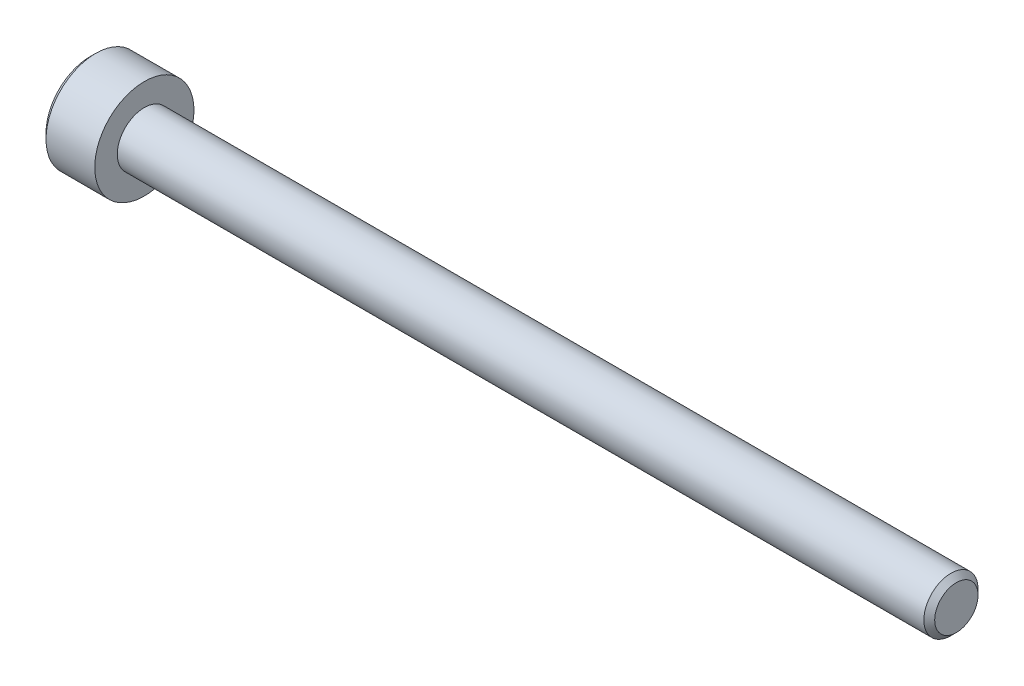
ISO-10303-21;
HEADER;
FILE_DESCRIPTION(('STEP AP214'),'2;1');
FILE_NAME('part.step','',(''),(''),'','','');
FILE_SCHEMA(('AUTOMOTIVE_DESIGN { 1 0 10303 214 1 1 1 1 }'));
ENDSEC;
DATA;
#1=APPLICATION_CONTEXT('core data for automotive mechanical design processes');
#2=APPLICATION_PROTOCOL_DEFINITION('international standard','automotive_design',2000,#1);
#3=PRODUCT_CONTEXT('',#1,'mechanical');
#4=PRODUCT('Part','Part','',(#3));
#5=PRODUCT_RELATED_PRODUCT_CATEGORY('part','',(#4));
#6=PRODUCT_DEFINITION_FORMATION('','',#4);
#7=PRODUCT_DEFINITION_CONTEXT('part definition',#1,'design');
#8=PRODUCT_DEFINITION('design','',#6,#7);
#9=PRODUCT_DEFINITION_SHAPE('','',#8);
#10=(LENGTH_UNIT() NAMED_UNIT(*) SI_UNIT(.MILLI.,.METRE.));
#11=(NAMED_UNIT(*) PLANE_ANGLE_UNIT() SI_UNIT($,.RADIAN.));
#12=(NAMED_UNIT(*) SI_UNIT($,.STERADIAN.) SOLID_ANGLE_UNIT());
#13=UNCERTAINTY_MEASURE_WITH_UNIT(LENGTH_MEASURE(1.E-05),#10,'distance_accuracy_value','');
#14=(GEOMETRIC_REPRESENTATION_CONTEXT(3) GLOBAL_UNCERTAINTY_ASSIGNED_CONTEXT((#13)) GLOBAL_UNIT_ASSIGNED_CONTEXT((#10,
#11,#12)) REPRESENTATION_CONTEXT('',''));
#15=CARTESIAN_POINT('',(0.,0.,0.));
#16=DIRECTION('',(0.,0.,1.));
#17=DIRECTION('',(1.,0.,0.));
#18=AXIS2_PLACEMENT_3D('',#15,#16,#17);
#19=CARTESIAN_POINT('',(-1.5,0.,0.));
#20=DIRECTION('',(-1.,0.,0.));
#21=DIRECTION('',(0.,0.,1.));
#22=AXIS2_PLACEMENT_3D('',#19,#20,#21);
#23=PLANE('',#22);
#24=DIRECTION('',(0.,-1.,0.));
#25=VECTOR('',#24,1.);
#26=CARTESIAN_POINT('',(-1.5,0.721687836487031,-1.25));
#27=LINE('',#26,#25);
#28=CARTESIAN_POINT('',(-1.5,0.721687836487031,-1.25));
#29=VERTEX_POINT('',#28);
#30=CARTESIAN_POINT('',(-1.50000000002341,0.,-1.25));
#31=VERTEX_POINT('',#30);
#32=EDGE_CURVE('E160',#29,#31,#27,.T.);
#33=ORIENTED_EDGE('',*,*,#32,.T.);
#34=CARTESIAN_POINT('',(-1.50000000002341,0.,0.));
#35=DIRECTION('',(1.,0.,0.));
#36=DIRECTION('',(0.,0.,-1.));
#37=AXIS2_PLACEMENT_3D('',#34,#35,#36);
#38=CIRCLE('',#37,1.24999999997044);
#39=CARTESIAN_POINT('',(-1.50000000002341,1.08253175470495,-0.624999999985219));
#40=VERTEX_POINT('',#39);
#41=EDGE_CURVE('E50',#31,#40,#38,.T.);
#42=ORIENTED_EDGE('',*,*,#41,.T.);
#43=DIRECTION('',(0.,-0.499999999999998,-0.86602540378444));
#44=VECTOR('',#43,1.);
#45=CARTESIAN_POINT('',(-1.5,1.44337567297406,0.));
#46=LINE('',#45,#44);
#47=EDGE_CURVE('E247',#40,#29,#46,.T.);
#48=ORIENTED_EDGE('',*,*,#47,.T.);
#49=EDGE_LOOP('',(#33,#42,#48));
#50=FACE_BOUND('',#49,.T.);
#51=ADVANCED_FACE('F35',(#50),#23,.T.);
#52=CARTESIAN_POINT('',(-1.5,1.44337567297406,0.));
#53=VERTEX_POINT('',#52);
#54=EDGE_CURVE('E248',#53,#40,#46,.T.);
#55=ORIENTED_EDGE('',*,*,#54,.T.);
#56=CARTESIAN_POINT('',(-1.50000000002341,1.08253175470495,0.624999999985218));
#57=VERTEX_POINT('',#56);
#58=EDGE_CURVE('E200',#40,#57,#38,.T.);
#59=ORIENTED_EDGE('',*,*,#58,.T.);
#60=DIRECTION('',(0.,0.499999999999998,-0.86602540378444));
#61=VECTOR('',#60,1.);
#62=CARTESIAN_POINT('',(-1.5,0.721687836487032,1.25));
#63=LINE('',#62,#61);
#64=EDGE_CURVE('E244',#57,#53,#63,.T.);
#65=ORIENTED_EDGE('',*,*,#64,.T.);
#66=EDGE_LOOP('',(#55,#59,#65));
#67=FACE_BOUND('',#66,.T.);
#68=ADVANCED_FACE('F123',(#67),#23,.T.);
#69=CARTESIAN_POINT('',(-1.5,0.721687836487032,1.25));
#70=VERTEX_POINT('',#69);
#71=EDGE_CURVE('E245',#70,#57,#63,.T.);
#72=ORIENTED_EDGE('',*,*,#71,.T.);
#73=CARTESIAN_POINT('',(-1.50000000002341,0.,1.24999999997044));
#74=VERTEX_POINT('',#73);
#75=EDGE_CURVE('E384',#57,#74,#38,.T.);
#76=ORIENTED_EDGE('',*,*,#75,.T.);
#77=DIRECTION('',(0.,1.,0.));
#78=VECTOR('',#77,1.);
#79=CARTESIAN_POINT('',(-1.5,-0.721687836487031,1.25));
#80=LINE('',#79,#78);
#81=EDGE_CURVE('E240',#74,#70,#80,.T.);
#82=ORIENTED_EDGE('',*,*,#81,.T.);
#83=EDGE_LOOP('',(#72,#76,#82));
#84=FACE_BOUND('',#83,.T.);
#85=ADVANCED_FACE('F129',(#84),#23,.T.);
#86=CARTESIAN_POINT('',(-1.5,-0.721687836487031,1.25));
#87=VERTEX_POINT('',#86);
#88=EDGE_CURVE('E228',#87,#74,#80,.T.);
#89=ORIENTED_EDGE('',*,*,#88,.T.);
#90=CARTESIAN_POINT('',(-1.50000000002341,-1.08253175470495,0.624999999985219));
#91=VERTEX_POINT('',#90);
#92=EDGE_CURVE('E382',#74,#91,#38,.T.);
#93=ORIENTED_EDGE('',*,*,#92,.T.);
#94=DIRECTION('',(0.,0.499999999999999,0.866025403784439));
#95=VECTOR('',#94,1.);
#96=CARTESIAN_POINT('',(-1.5,-1.44337567297406,0.));
#97=LINE('',#96,#95);
#98=EDGE_CURVE('E180',#91,#87,#97,.T.);
#99=ORIENTED_EDGE('',*,*,#98,.T.);
#100=EDGE_LOOP('',(#89,#93,#99));
#101=FACE_BOUND('',#100,.T.);
#102=ADVANCED_FACE('F144',(#101),#23,.T.);
#103=CARTESIAN_POINT('',(-1.5,-1.44337567297406,0.));
#104=VERTEX_POINT('',#103);
#105=EDGE_CURVE('E233',#104,#91,#97,.T.);
#106=ORIENTED_EDGE('',*,*,#105,.T.);
#107=CARTESIAN_POINT('',(-1.50000000002341,-1.08253175470495,-0.624999999985218));
#108=VERTEX_POINT('',#107);
#109=EDGE_CURVE('E238',#91,#108,#38,.T.);
#110=ORIENTED_EDGE('',*,*,#109,.T.);
#111=DIRECTION('',(0.,-0.499999999999998,0.86602540378444));
#112=VECTOR('',#111,1.);
#113=CARTESIAN_POINT('',(-1.5,-0.721687836487032,-1.25));
#114=LINE('',#113,#112);
#115=EDGE_CURVE('E156',#108,#104,#114,.T.);
#116=ORIENTED_EDGE('',*,*,#115,.T.);
#117=EDGE_LOOP('',(#106,#110,#116));
#118=FACE_BOUND('',#117,.T.);
#119=ADVANCED_FACE('F135',(#118),#23,.T.);
#120=CARTESIAN_POINT('',(-1.5,-0.721687836487032,-1.25));
#121=VERTEX_POINT('',#120);
#122=EDGE_CURVE('E148',#121,#108,#114,.T.);
#123=ORIENTED_EDGE('',*,*,#122,.T.);
#124=EDGE_CURVE('E149',#108,#31,#38,.T.);
#125=ORIENTED_EDGE('',*,*,#124,.T.);
#126=EDGE_CURVE('E151',#31,#121,#27,.T.);
#127=ORIENTED_EDGE('',*,*,#126,.T.);
#128=EDGE_LOOP('',(#123,#125,#127));
#129=FACE_BOUND('',#128,.T.);
#130=ADVANCED_FACE('F125',(#129),#23,.T.);
#131=CARTESIAN_POINT('',(0.,0.,0.));
#132=DIRECTION('',(1.,0.,0.));
#133=DIRECTION('',(0.,0.,-1.));
#134=AXIS2_PLACEMENT_3D('',#131,#132,#133);
#135=PLANE('',#134);
#136=CARTESIAN_POINT('',(0.,0.,0.));
#137=DIRECTION('',(1.,0.,0.));
#138=DIRECTION('',(0.,0.,-1.));
#139=AXIS2_PLACEMENT_3D('',#136,#137,#138);
#140=CIRCLE('',#139,2.75);
#141=CARTESIAN_POINT('',(0.,0.,-2.75));
#142=VERTEX_POINT('',#141);
#143=EDGE_CURVE('E193',#142,#142,#140,.T.);
#144=ORIENTED_EDGE('',*,*,#143,.T.);
#145=EDGE_LOOP('',(#144));
#146=FACE_BOUND('',#145,.T.);
#147=CARTESIAN_POINT('',(0.,0.,0.));
#148=DIRECTION('',(1.,0.,0.));
#149=DIRECTION('',(0.,0.,-1.));
#150=AXIS2_PLACEMENT_3D('',#147,#148,#149);
#151=CIRCLE('',#150,1.5);
#152=CARTESIAN_POINT('',(0.,0.,1.5));
#153=VERTEX_POINT('',#152);
#154=EDGE_CURVE('E183',#153,#153,#151,.T.);
#155=ORIENTED_EDGE('',*,*,#154,.F.);
#156=EDGE_LOOP('',(#155));
#157=FACE_BOUND('',#156,.T.);
#158=ADVANCED_FACE('F134',(#146,#157),#135,.T.);
#159=CARTESIAN_POINT('',(-3.,0.,0.));
#160=DIRECTION('',(1.,0.,0.));
#161=DIRECTION('',(0.,0.,-1.));
#162=AXIS2_PLACEMENT_3D('',#159,#160,#161);
#163=CYLINDRICAL_SURFACE('',#162,2.75);
#164=CARTESIAN_POINT('',(-2.70000000001219,0.,0.));
#165=DIRECTION('',(-1.,0.,0.));
#166=DIRECTION('',(0.,0.,1.));
#167=AXIS2_PLACEMENT_3D('',#164,#165,#166);
#168=CIRCLE('',#167,2.75);
#169=CARTESIAN_POINT('',(-2.70000000001219,0.,2.75));
#170=VERTEX_POINT('',#169);
#171=EDGE_CURVE('E43',#170,#170,#168,.F.);
#172=ORIENTED_EDGE('',*,*,#171,.T.);
#173=EDGE_LOOP('',(#172));
#174=FACE_BOUND('',#173,.T.);
#175=ORIENTED_EDGE('',*,*,#143,.F.);
#176=EDGE_LOOP('',(#175));
#177=FACE_BOUND('',#176,.T.);
#178=ADVANCED_FACE('F141',(#174,#177),#163,.T.);
#179=CARTESIAN_POINT('',(-3.,2.75,0.));
#180=DIRECTION('',(-1.,0.,0.));
#181=DIRECTION('',(0.,0.,1.));
#182=AXIS2_PLACEMENT_3D('',#179,#180,#181);
#183=PLANE('',#182);
#184=CARTESIAN_POINT('',(-3.,0.,0.));
#185=DIRECTION('',(-1.,0.,0.));
#186=DIRECTION('',(0.,0.,1.));
#187=AXIS2_PLACEMENT_3D('',#184,#185,#186);
#188=CIRCLE('',#187,2.45000000001218);
#189=CARTESIAN_POINT('',(-3.,0.,2.45000000001218));
#190=VERTEX_POINT('',#189);
#191=EDGE_CURVE('E11',#190,#190,#188,.T.);
#192=ORIENTED_EDGE('',*,*,#191,.T.);
#193=EDGE_LOOP('',(#192));
#194=FACE_BOUND('',#193,.T.);
#195=DIRECTION('',(0.,0.499999999999999,0.866025403784439));
#196=VECTOR('',#195,1.);
#197=CARTESIAN_POINT('',(-3.,-1.44337567297406,0.));
#198=LINE('',#197,#196);
#199=CARTESIAN_POINT('',(-3.,-1.44337567297406,0.));
#200=VERTEX_POINT('',#199);
#201=CARTESIAN_POINT('',(-3.,-0.721687836487031,1.25));
#202=VERTEX_POINT('',#201);
#203=EDGE_CURVE('E58',#200,#202,#198,.T.);
#204=ORIENTED_EDGE('',*,*,#203,.F.);
#205=DIRECTION('',(0.,-0.499999999999998,0.86602540378444));
#206=VECTOR('',#205,1.);
#207=CARTESIAN_POINT('',(-3.,-0.721687836487032,-1.25));
#208=LINE('',#207,#206);
#209=CARTESIAN_POINT('',(-3.,-0.721687836487032,-1.25));
#210=VERTEX_POINT('',#209);
#211=EDGE_CURVE('E177',#210,#200,#208,.T.);
#212=ORIENTED_EDGE('',*,*,#211,.F.);
#213=DIRECTION('',(0.,-1.,0.));
#214=VECTOR('',#213,1.);
#215=CARTESIAN_POINT('',(-3.,0.721687836487031,-1.25));
#216=LINE('',#215,#214);
#217=CARTESIAN_POINT('',(-3.,0.721687836487031,-1.25));
#218=VERTEX_POINT('',#217);
#219=EDGE_CURVE('E174',#218,#210,#216,.T.);
#220=ORIENTED_EDGE('',*,*,#219,.F.);
#221=DIRECTION('',(0.,-0.499999999999998,-0.86602540378444));
#222=VECTOR('',#221,1.);
#223=CARTESIAN_POINT('',(-3.,1.44337567297406,0.));
#224=LINE('',#223,#222);
#225=CARTESIAN_POINT('',(-3.,1.44337567297406,0.));
#226=VERTEX_POINT('',#225);
#227=EDGE_CURVE('E171',#226,#218,#224,.T.);
#228=ORIENTED_EDGE('',*,*,#227,.F.);
#229=DIRECTION('',(0.,0.499999999999998,-0.86602540378444));
#230=VECTOR('',#229,1.);
#231=CARTESIAN_POINT('',(-3.,0.721687836487032,1.25));
#232=LINE('',#231,#230);
#233=CARTESIAN_POINT('',(-3.,0.721687836487032,1.25));
#234=VERTEX_POINT('',#233);
#235=EDGE_CURVE('E168',#234,#226,#232,.T.);
#236=ORIENTED_EDGE('',*,*,#235,.F.);
#237=DIRECTION('',(0.,1.,0.));
#238=VECTOR('',#237,1.);
#239=CARTESIAN_POINT('',(-3.,-0.721687836487031,1.25));
#240=LINE('',#239,#238);
#241=EDGE_CURVE('E165',#202,#234,#240,.T.);
#242=ORIENTED_EDGE('',*,*,#241,.F.);
#243=EDGE_LOOP('',(#204,#212,#220,#228,#236,#242));
#244=FACE_BOUND('',#243,.T.);
#245=ADVANCED_FACE('F213',(#194,#244),#183,.T.);
#246=CARTESIAN_POINT('',(45.,0.,0.));
#247=DIRECTION('',(-1.,0.,0.));
#248=DIRECTION('',(0.,0.,1.));
#249=AXIS2_PLACEMENT_3D('',#246,#247,#248);
#250=CYLINDRICAL_SURFACE('',#249,1.5);
#251=CARTESIAN_POINT('',(44.7000000000122,0.,0.));
#252=DIRECTION('',(1.,0.,0.));
#253=DIRECTION('',(0.,0.,-1.));
#254=AXIS2_PLACEMENT_3D('',#251,#252,#253);
#255=CIRCLE('',#254,1.5);
#256=CARTESIAN_POINT('',(44.7000000000122,0.,1.5));
#257=VERTEX_POINT('',#256);
#258=EDGE_CURVE('E199',#257,#257,#255,.F.);
#259=CARTESIAN_POINT('',(44.7000000000122,0.,1.5));
#260=CARTESIAN_POINT('',(44.2343750000121,0.,1.5));
#261=CARTESIAN_POINT('',(43.7687500000119,0.,1.5));
#262=CARTESIAN_POINT('',(42.8375000000117,0.,1.5));
#263=CARTESIAN_POINT('',(42.3718750000116,0.,1.5));
#264=CARTESIAN_POINT('',(41.4406250000113,0.,1.5));
#265=CARTESIAN_POINT('',(40.9750000000112,0.,1.5));
#266=CARTESIAN_POINT('',(40.0437500000109,0.,1.5));
#267=CARTESIAN_POINT('',(39.5781250000108,0.,1.5));
#268=CARTESIAN_POINT('',(38.6468750000106,0.,1.5));
#269=CARTESIAN_POINT('',(38.1812500000104,0.,1.5));
#270=CARTESIAN_POINT('',(37.2500000000102,0.,1.5));
#271=CARTESIAN_POINT('',(36.7843750000101,0.,1.5));
#272=CARTESIAN_POINT('',(35.8531250000098,0.,1.5));
#273=CARTESIAN_POINT('',(35.3875000000097,0.,1.5));
#274=CARTESIAN_POINT('',(34.4562500000094,0.,1.5));
#275=CARTESIAN_POINT('',(33.9906250000093,0.,1.5));
#276=CARTESIAN_POINT('',(33.059375000009,0.,1.5));
#277=CARTESIAN_POINT('',(32.5937500000089,0.,1.5));
#278=CARTESIAN_POINT('',(31.6625000000086,0.,1.5));
#279=CARTESIAN_POINT('',(31.1968750000085,0.,1.5));
#280=CARTESIAN_POINT('',(30.2656250000083,0.,1.5));
#281=CARTESIAN_POINT('',(29.8000000000081,0.,1.5));
#282=CARTESIAN_POINT('',(28.8687500000079,0.,1.5));
#283=CARTESIAN_POINT('',(28.4031250000078,0.,1.5));
#284=CARTESIAN_POINT('',(27.4718750000075,0.,1.5));
#285=CARTESIAN_POINT('',(27.0062500000074,0.,1.5));
#286=CARTESIAN_POINT('',(26.0750000000071,0.,1.5));
#287=CARTESIAN_POINT('',(25.609375000007,0.,1.5));
#288=CARTESIAN_POINT('',(24.6781250000067,0.,1.5));
#289=CARTESIAN_POINT('',(24.2125000000066,0.,1.5));
#290=CARTESIAN_POINT('',(23.2812500000064,0.,1.5));
#291=CARTESIAN_POINT('',(22.8156250000062,0.,1.5));
#292=CARTESIAN_POINT('',(21.884375000006,0.,1.5));
#293=CARTESIAN_POINT('',(21.4187500000058,0.,1.5));
#294=CARTESIAN_POINT('',(20.4875000000056,0.,1.5));
#295=CARTESIAN_POINT('',(20.0218750000055,0.,1.5));
#296=CARTESIAN_POINT('',(19.0906250000052,0.,1.5));
#297=CARTESIAN_POINT('',(18.6250000000051,0.,1.5));
#298=CARTESIAN_POINT('',(17.6937500000048,0.,1.5));
#299=CARTESIAN_POINT('',(17.2281250000047,0.,1.5));
#300=CARTESIAN_POINT('',(16.2968750000044,0.,1.5));
#301=CARTESIAN_POINT('',(15.8312500000043,0.,1.5));
#302=CARTESIAN_POINT('',(14.9000000000041,0.,1.5));
#303=CARTESIAN_POINT('',(14.4343750000039,0.,1.5));
#304=CARTESIAN_POINT('',(13.5031250000037,0.,1.5));
#305=CARTESIAN_POINT('',(13.0375000000036,0.,1.5));
#306=CARTESIAN_POINT('',(12.1062500000033,0.,1.5));
#307=CARTESIAN_POINT('',(11.6406250000032,0.,1.5));
#308=CARTESIAN_POINT('',(10.7093750000029,0.,1.5));
#309=CARTESIAN_POINT('',(10.2437500000028,0.,1.5));
#310=CARTESIAN_POINT('',(9.31250000000254,0.,1.5));
#311=CARTESIAN_POINT('',(8.84687500000242,0.,1.5));
#312=CARTESIAN_POINT('',(7.91562500000216,0.,1.5));
#313=CARTESIAN_POINT('',(7.45000000000204,0.,1.5));
#314=CARTESIAN_POINT('',(6.51875000000178,0.,1.5));
#315=CARTESIAN_POINT('',(6.05312500000166,0.,1.5));
#316=CARTESIAN_POINT('',(5.1218750000014,0.,1.5));
#317=CARTESIAN_POINT('',(4.65625000000127,0.,1.5));
#318=CARTESIAN_POINT('',(3.72500000000102,0.,1.5));
#319=CARTESIAN_POINT('',(3.25937500000089,0.,1.5));
#320=CARTESIAN_POINT('',(2.32812500000063,0.,1.5));
#321=CARTESIAN_POINT('',(1.8625000000005,0.,1.5));
#322=CARTESIAN_POINT('',(0.931250000000247,0.,1.5));
#323=CARTESIAN_POINT('',(0.46562500000012,0.,1.5));
#324=CARTESIAN_POINT('',(0.,0.,1.5));
#325=B_SPLINE_CURVE_WITH_KNOTS('',3,(#259,#260,#261,#262,#263,#264,#265,#266,#267,#268,#269,
#270,#271,#272,#273,#274,#275,#276,#277,#278,#279,#280,#281,#282,#283,#284,#285,#286,#287,#288,
#289,#290,#291,#292,#293,#294,#295,#296,#297,#298,#299,#300,#301,#302,#303,#304,#305,#306,#307,
#308,#309,#310,#311,#312,#313,#314,#315,#316,#317,#318,#319,#320,#321,#322,#323,#324),
.UNSPECIFIED.,.F.,.F.,(4,2,2,2,2,2,2,2,2,2,2,2,2,2,2,2,2,2,2,2,2,2,2,2,2,2,2,2,2,2,2,2,4),(0.,
1.39687500000039,2.79375000000077,4.19062500000115,5.58750000000153,6.98437500000191,
8.38125000000229,9.77812500000267,11.1750000000031,12.5718750000034,13.9687500000038,
15.3656250000042,16.7625000000046,18.159375000005,19.5562500000053,20.9531250000057,
22.3500000000061,23.7468750000065,25.1437500000069,26.5406250000073,27.9375000000076,
29.334375000008,30.7312500000084,32.1281250000088,33.5250000000092,34.9218750000095,
36.3187500000099,37.7156250000103,39.1125000000107,40.5093750000111,41.9062500000115,
43.3031250000118,44.7000000000122),.UNSPECIFIED.);
#326=EDGE_CURVE('BSEAM216',#257,#153,#325,.T.);
#327=ORIENTED_EDGE('',*,*,#258,.T.);
#328=ORIENTED_EDGE('',*,*,#154,.T.);
#329=ORIENTED_EDGE('',*,*,#326,.T.);
#330=ORIENTED_EDGE('',*,*,#326,.F.);
#331=EDGE_LOOP('',(#327,#329,#328,#330));
#332=FACE_BOUND('',#331,.T.);
#333=ADVANCED_FACE('F216',(#332),#250,.T.);
#334=CARTESIAN_POINT('',(45.,0.,0.));
#335=DIRECTION('',(1.,0.,0.));
#336=DIRECTION('',(0.,0.,-1.));
#337=AXIS2_PLACEMENT_3D('',#334,#335,#336);
#338=PLANE('',#337);
#339=CARTESIAN_POINT('',(45.,0.,0.));
#340=DIRECTION('',(1.,0.,0.));
#341=DIRECTION('',(0.,0.,-1.));
#342=AXIS2_PLACEMENT_3D('',#339,#340,#341);
#343=CIRCLE('',#342,1.20000000001221);
#344=CARTESIAN_POINT('',(45.,0.,-1.20000000001221));
#345=VERTEX_POINT('',#344);
#346=EDGE_CURVE('E196',#345,#345,#343,.T.);
#347=ORIENTED_EDGE('',*,*,#346,.T.);
#348=EDGE_LOOP('',(#347));
#349=FACE_BOUND('',#348,.T.);
#350=ADVANCED_FACE('F266',(#349),#338,.T.);
#351=CARTESIAN_POINT('',(-1.5,-1.44337567297406,0.));
#352=DIRECTION('',(0.,-0.866025403784439,0.499999999999999));
#353=DIRECTION('',(0.,-0.499999999999999,-0.866025403784439));
#354=AXIS2_PLACEMENT_3D('',#351,#352,#353);
#355=PLANE('',#354);
#356=ORIENTED_EDGE('',*,*,#203,.T.);
#357=DIRECTION('',(-1.,0.,0.));
#358=VECTOR('',#357,1.);
#359=CARTESIAN_POINT('',(-1.5,-0.721687836487031,1.25));
#360=LINE('',#359,#358);
#361=EDGE_CURVE('E155',#87,#202,#360,.T.);
#362=ORIENTED_EDGE('',*,*,#361,.F.);
#363=ORIENTED_EDGE('',*,*,#98,.F.);
#364=ORIENTED_EDGE('',*,*,#105,.F.);
#365=DIRECTION('',(-1.,0.,0.));
#366=VECTOR('',#365,1.);
#367=CARTESIAN_POINT('',(-1.5,-1.44337567297406,0.));
#368=LINE('',#367,#366);
#369=EDGE_CURVE('E181',#104,#200,#368,.T.);
#370=ORIENTED_EDGE('',*,*,#369,.T.);
#371=EDGE_LOOP('',(#356,#362,#363,#364,#370));
#372=FACE_BOUND('',#371,.T.);
#373=ADVANCED_FACE('F230',(#372),#355,.F.);
#374=CARTESIAN_POINT('',(-1.5,-0.721687836487032,-1.25));
#375=DIRECTION('',(0.,-0.86602540378444,-0.499999999999998));
#376=DIRECTION('',(0.,0.499999999999998,-0.86602540378444));
#377=AXIS2_PLACEMENT_3D('',#374,#375,#376);
#378=PLANE('',#377);
#379=ORIENTED_EDGE('',*,*,#211,.T.);
#380=ORIENTED_EDGE('',*,*,#369,.F.);
#381=ORIENTED_EDGE('',*,*,#115,.F.);
#382=ORIENTED_EDGE('',*,*,#122,.F.);
#383=DIRECTION('',(-1.,0.,0.));
#384=VECTOR('',#383,1.);
#385=CARTESIAN_POINT('',(-1.5,-0.721687836487032,-1.25));
#386=LINE('',#385,#384);
#387=EDGE_CURVE('E184',#121,#210,#386,.T.);
#388=ORIENTED_EDGE('',*,*,#387,.T.);
#389=EDGE_LOOP('',(#379,#380,#381,#382,#388));
#390=FACE_BOUND('',#389,.T.);
#391=ADVANCED_FACE('F259',(#390),#378,.F.);
#392=CARTESIAN_POINT('',(-1.5,0.721687836487031,-1.25));
#393=DIRECTION('',(0.,0.,-1.));
#394=DIRECTION('',(0.,1.,0.));
#395=AXIS2_PLACEMENT_3D('',#392,#393,#394);
#396=PLANE('',#395);
#397=ORIENTED_EDGE('',*,*,#219,.T.);
#398=ORIENTED_EDGE('',*,*,#387,.F.);
#399=ORIENTED_EDGE('',*,*,#126,.F.);
#400=ORIENTED_EDGE('',*,*,#32,.F.);
#401=DIRECTION('',(-1.,0.,0.));
#402=VECTOR('',#401,1.);
#403=CARTESIAN_POINT('',(-1.5,0.721687836487031,-1.25));
#404=LINE('',#403,#402);
#405=EDGE_CURVE('E186',#29,#218,#404,.T.);
#406=ORIENTED_EDGE('',*,*,#405,.T.);
#407=EDGE_LOOP('',(#397,#398,#399,#400,#406));
#408=FACE_BOUND('',#407,.T.);
#409=ADVANCED_FACE('F258',(#408),#396,.F.);
#410=CARTESIAN_POINT('',(-1.5,1.44337567297406,0.));
#411=DIRECTION('',(0.,0.86602540378444,-0.499999999999998));
#412=DIRECTION('',(0.,0.499999999999998,0.86602540378444));
#413=AXIS2_PLACEMENT_3D('',#410,#411,#412);
#414=PLANE('',#413);
#415=ORIENTED_EDGE('',*,*,#227,.T.);
#416=ORIENTED_EDGE('',*,*,#405,.F.);
#417=ORIENTED_EDGE('',*,*,#47,.F.);
#418=ORIENTED_EDGE('',*,*,#54,.F.);
#419=DIRECTION('',(-1.,0.,0.));
#420=VECTOR('',#419,1.);
#421=CARTESIAN_POINT('',(-1.5,1.44337567297406,0.));
#422=LINE('',#421,#420);
#423=EDGE_CURVE('E188',#53,#226,#422,.T.);
#424=ORIENTED_EDGE('',*,*,#423,.T.);
#425=EDGE_LOOP('',(#415,#416,#417,#418,#424));
#426=FACE_BOUND('',#425,.T.);
#427=ADVANCED_FACE('F256',(#426),#414,.F.);
#428=CARTESIAN_POINT('',(-1.5,0.721687836487032,1.25));
#429=DIRECTION('',(0.,0.86602540378444,0.499999999999998));
#430=DIRECTION('',(0.,-0.499999999999998,0.86602540378444));
#431=AXIS2_PLACEMENT_3D('',#428,#429,#430);
#432=PLANE('',#431);
#433=ORIENTED_EDGE('',*,*,#235,.T.);
#434=ORIENTED_EDGE('',*,*,#423,.F.);
#435=ORIENTED_EDGE('',*,*,#64,.F.);
#436=ORIENTED_EDGE('',*,*,#71,.F.);
#437=DIRECTION('',(-1.,0.,0.));
#438=VECTOR('',#437,1.);
#439=CARTESIAN_POINT('',(-1.5,0.721687836487032,1.25));
#440=LINE('',#439,#438);
#441=EDGE_CURVE('E158',#70,#234,#440,.T.);
#442=ORIENTED_EDGE('',*,*,#441,.T.);
#443=EDGE_LOOP('',(#433,#434,#435,#436,#442));
#444=FACE_BOUND('',#443,.T.);
#445=ADVANCED_FACE('F118',(#444),#432,.F.);
#446=CARTESIAN_POINT('',(-1.5,-0.721687836487031,1.25));
#447=DIRECTION('',(0.,0.,1.));
#448=DIRECTION('',(1.,0.,0.));
#449=AXIS2_PLACEMENT_3D('',#446,#447,#448);
#450=PLANE('',#449);
#451=ORIENTED_EDGE('',*,*,#241,.T.);
#452=ORIENTED_EDGE('',*,*,#441,.F.);
#453=ORIENTED_EDGE('',*,*,#81,.F.);
#454=ORIENTED_EDGE('',*,*,#88,.F.);
#455=ORIENTED_EDGE('',*,*,#361,.T.);
#456=EDGE_LOOP('',(#451,#452,#453,#454,#455));
#457=FACE_BOUND('',#456,.T.);
#458=ADVANCED_FACE('F111',(#457),#450,.F.);
#459=CARTESIAN_POINT('',(-1.16506350937176,0.,0.));
#460=DIRECTION('',(-1.,0.,0.));
#461=DIRECTION('',(0.,0.,1.));
#462=AXIS2_PLACEMENT_3D('',#459,#460,#461);
#463=CONICAL_SURFACE('',#462,0.,1.30899693890568);
#464=ORIENTED_EDGE('',*,*,#41,.F.);
#465=ORIENTED_EDGE('',*,*,#124,.F.);
#466=ORIENTED_EDGE('',*,*,#109,.F.);
#467=ORIENTED_EDGE('',*,*,#92,.F.);
#468=ORIENTED_EDGE('',*,*,#75,.F.);
#469=ORIENTED_EDGE('',*,*,#58,.F.);
#470=EDGE_LOOP('',(#464,#465,#466,#467,#468,#469));
#471=FACE_BOUND('',#470,.T.);
#472=CARTESIAN_POINT('',(-1.16506350937176,0.,0.));
#473=VERTEX_POINT('',#472);
#474=VERTEX_LOOP('',#473);
#475=FACE_BOUND('',#474,.T.);
#476=ADVANCED_FACE('F108',(#471,#475),#463,.F.);
#477=CARTESIAN_POINT('',(45.,0.,0.));
#478=DIRECTION('',(-1.,0.,0.));
#479=DIRECTION('',(0.,0.,1.));
#480=AXIS2_PLACEMENT_3D('',#477,#478,#479);
#481=CONICAL_SURFACE('',#480,1.20000000001221,0.785398163397447);
#482=ORIENTED_EDGE('',*,*,#258,.F.);
#483=EDGE_LOOP('',(#482));
#484=FACE_BOUND('',#483,.T.);
#485=ORIENTED_EDGE('',*,*,#346,.F.);
#486=EDGE_LOOP('',(#485));
#487=FACE_BOUND('',#486,.T.);
#488=ADVANCED_FACE('F110',(#484,#487),#481,.T.);
#489=CARTESIAN_POINT('',(-2.70000000001219,0.,0.));
#490=DIRECTION('',(1.,0.,0.));
#491=DIRECTION('',(0.,0.,-1.));
#492=AXIS2_PLACEMENT_3D('',#489,#490,#491);
#493=CONICAL_SURFACE('',#492,2.75,0.785398163397462);
#494=ORIENTED_EDGE('',*,*,#191,.F.);
#495=EDGE_LOOP('',(#494));
#496=FACE_BOUND('',#495,.T.);
#497=ORIENTED_EDGE('',*,*,#171,.F.);
#498=EDGE_LOOP('',(#497));
#499=FACE_BOUND('',#498,.T.);
#500=ADVANCED_FACE('F37',(#496,#499),#493,.T.);
#501=CLOSED_SHELL('',(#51,#68,#85,#102,#119,#130,#158,#178,#245,#333,#350,#373,#391,#409,#427,
#445,#458,#476,#488,#500));
#502=MANIFOLD_SOLID_BREP('B2',#501);
#503=ADVANCED_BREP_SHAPE_REPRESENTATION('',(#18,#502),#14);
#504=SHAPE_DEFINITION_REPRESENTATION(#9,#503);
ENDSEC;
END-ISO-10303-21;
